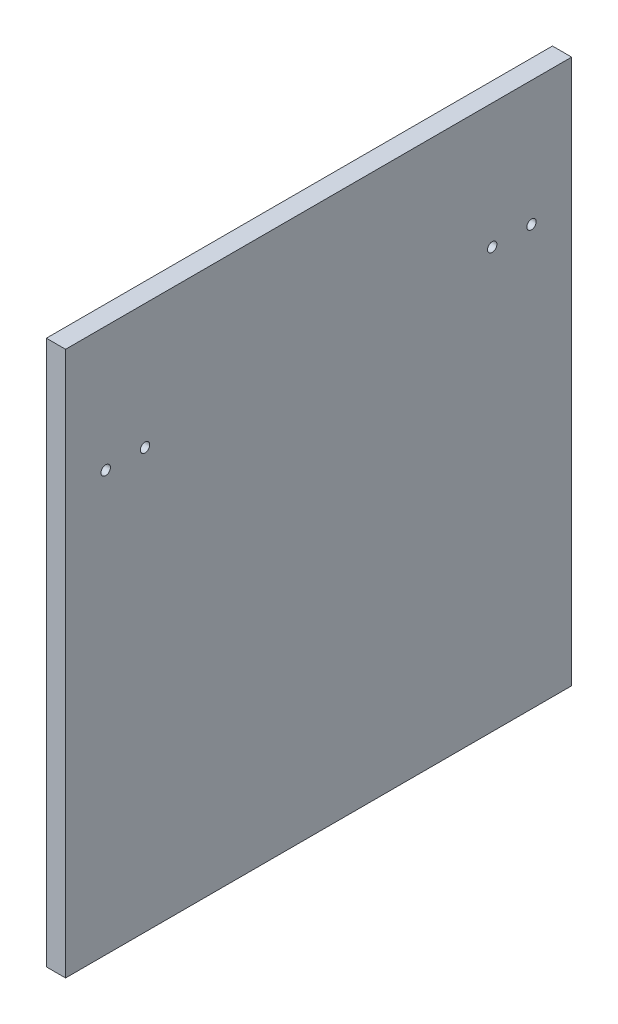
ISO-10303-21;
HEADER;
FILE_DESCRIPTION(('STEP AP214'),'2;1');
FILE_NAME('part.step','',(''),(''),'','','');
FILE_SCHEMA(('AUTOMOTIVE_DESIGN { 1 0 10303 214 1 1 1 1 }'));
ENDSEC;
DATA;
#1=APPLICATION_CONTEXT('core data for automotive mechanical design processes');
#2=APPLICATION_PROTOCOL_DEFINITION('international standard','automotive_design',2000,#1);
#3=PRODUCT_CONTEXT('',#1,'mechanical');
#4=PRODUCT('Part','Part','',(#3));
#5=PRODUCT_RELATED_PRODUCT_CATEGORY('part','',(#4));
#6=PRODUCT_DEFINITION_FORMATION('','',#4);
#7=PRODUCT_DEFINITION_CONTEXT('part definition',#1,'design');
#8=PRODUCT_DEFINITION('design','',#6,#7);
#9=PRODUCT_DEFINITION_SHAPE('','',#8);
#10=(LENGTH_UNIT() NAMED_UNIT(*) SI_UNIT(.MILLI.,.METRE.));
#11=(NAMED_UNIT(*) PLANE_ANGLE_UNIT() SI_UNIT($,.RADIAN.));
#12=(NAMED_UNIT(*) SI_UNIT($,.STERADIAN.) SOLID_ANGLE_UNIT());
#13=UNCERTAINTY_MEASURE_WITH_UNIT(LENGTH_MEASURE(1.E-05),#10,'distance_accuracy_value','');
#14=(GEOMETRIC_REPRESENTATION_CONTEXT(3) GLOBAL_UNCERTAINTY_ASSIGNED_CONTEXT((#13)) GLOBAL_UNIT_ASSIGNED_CONTEXT((#10,
#11,#12)) REPRESENTATION_CONTEXT('',''));
#15=CARTESIAN_POINT('',(0.,0.,0.));
#16=DIRECTION('',(0.,0.,1.));
#17=DIRECTION('',(1.,0.,0.));
#18=AXIS2_PLACEMENT_3D('',#15,#16,#17);
#19=CARTESIAN_POINT('',(6.35,-90.,83.65));
#20=DIRECTION('',(0.,0.,-1.));
#21=DIRECTION('',(-1.,0.,0.));
#22=AXIS2_PLACEMENT_3D('',#19,#20,#21);
#23=PLANE('',#22);
#24=DIRECTION('',(0.,-1.,0.));
#25=VECTOR('',#24,1.);
#26=CARTESIAN_POINT('',(0.,-90.,83.65));
#27=LINE('',#26,#25);
#28=CARTESIAN_POINT('',(0.,90.,83.65));
#29=VERTEX_POINT('',#28);
#30=CARTESIAN_POINT('',(0.,-90.,83.65));
#31=VERTEX_POINT('',#30);
#32=EDGE_CURVE('E96',#29,#31,#27,.T.);
#33=ORIENTED_EDGE('',*,*,#32,.T.);
#34=DIRECTION('',(-1.,0.,0.));
#35=VECTOR('',#34,1.);
#36=CARTESIAN_POINT('',(6.35,-90.,83.65));
#37=LINE('',#36,#35);
#38=CARTESIAN_POINT('',(6.35,-90.,83.65));
#39=VERTEX_POINT('',#38);
#40=EDGE_CURVE('E11',#39,#31,#37,.T.);
#41=ORIENTED_EDGE('',*,*,#40,.F.);
#42=DIRECTION('',(0.,-1.,0.));
#43=VECTOR('',#42,1.);
#44=CARTESIAN_POINT('',(6.35,-90.,83.65));
#45=LINE('',#44,#43);
#46=CARTESIAN_POINT('',(6.35,90.,83.65));
#47=VERTEX_POINT('',#46);
#48=EDGE_CURVE('E84',#47,#39,#45,.T.);
#49=ORIENTED_EDGE('',*,*,#48,.F.);
#50=DIRECTION('',(-1.,0.,0.));
#51=VECTOR('',#50,1.);
#52=CARTESIAN_POINT('',(6.35,90.,83.65));
#53=LINE('',#52,#51);
#54=EDGE_CURVE('E92',#47,#29,#53,.T.);
#55=ORIENTED_EDGE('',*,*,#54,.T.);
#56=EDGE_LOOP('',(#33,#41,#49,#55));
#57=FACE_BOUND('',#56,.T.);
#58=ADVANCED_FACE('F33',(#57),#23,.F.);
#59=CARTESIAN_POINT('',(6.35,-90.,-83.65));
#60=DIRECTION('',(0.,1.,0.));
#61=DIRECTION('',(0.,0.,1.));
#62=AXIS2_PLACEMENT_3D('',#59,#60,#61);
#63=PLANE('',#62);
#64=DIRECTION('',(0.,0.,-1.));
#65=VECTOR('',#64,1.);
#66=CARTESIAN_POINT('',(0.,-90.,-83.65));
#67=LINE('',#66,#65);
#68=CARTESIAN_POINT('',(0.,-90.,-83.65));
#69=VERTEX_POINT('',#68);
#70=EDGE_CURVE('E88',#31,#69,#67,.T.);
#71=ORIENTED_EDGE('',*,*,#70,.T.);
#72=DIRECTION('',(-1.,0.,0.));
#73=VECTOR('',#72,1.);
#74=CARTESIAN_POINT('',(6.35,-90.,-83.65));
#75=LINE('',#74,#73);
#76=CARTESIAN_POINT('',(6.35,-90.,-83.65));
#77=VERTEX_POINT('',#76);
#78=EDGE_CURVE('E41',#77,#69,#75,.T.);
#79=ORIENTED_EDGE('',*,*,#78,.F.);
#80=DIRECTION('',(0.,0.,-1.));
#81=VECTOR('',#80,1.);
#82=CARTESIAN_POINT('',(6.35,-90.,-83.65));
#83=LINE('',#82,#81);
#84=EDGE_CURVE('E79',#39,#77,#83,.T.);
#85=ORIENTED_EDGE('',*,*,#84,.F.);
#86=ORIENTED_EDGE('',*,*,#40,.T.);
#87=EDGE_LOOP('',(#71,#79,#85,#86));
#88=FACE_BOUND('',#87,.T.);
#89=ADVANCED_FACE('F87',(#88),#63,.F.);
#90=CARTESIAN_POINT('',(6.35,-90.,-83.65));
#91=DIRECTION('',(0.,0.,1.));
#92=DIRECTION('',(1.,0.,0.));
#93=AXIS2_PLACEMENT_3D('',#90,#91,#92);
#94=PLANE('',#93);
#95=DIRECTION('',(0.,1.,0.));
#96=VECTOR('',#95,1.);
#97=CARTESIAN_POINT('',(0.,-90.,-83.65));
#98=LINE('',#97,#96);
#99=CARTESIAN_POINT('',(0.,90.,-83.65));
#100=VERTEX_POINT('',#99);
#101=EDGE_CURVE('E66',#69,#100,#98,.T.);
#102=ORIENTED_EDGE('',*,*,#101,.T.);
#103=DIRECTION('',(-1.,0.,0.));
#104=VECTOR('',#103,1.);
#105=CARTESIAN_POINT('',(6.35,90.,-83.65));
#106=LINE('',#105,#104);
#107=CARTESIAN_POINT('',(6.35,90.,-83.65));
#108=VERTEX_POINT('',#107);
#109=EDGE_CURVE('E89',#108,#100,#106,.T.);
#110=ORIENTED_EDGE('',*,*,#109,.F.);
#111=DIRECTION('',(0.,1.,0.));
#112=VECTOR('',#111,1.);
#113=CARTESIAN_POINT('',(6.35,-90.,-83.65));
#114=LINE('',#113,#112);
#115=EDGE_CURVE('E82',#77,#108,#114,.T.);
#116=ORIENTED_EDGE('',*,*,#115,.F.);
#117=ORIENTED_EDGE('',*,*,#78,.T.);
#118=EDGE_LOOP('',(#102,#110,#116,#117));
#119=FACE_BOUND('',#118,.T.);
#120=ADVANCED_FACE('F90',(#119),#94,.F.);
#121=CARTESIAN_POINT('',(6.35,90.,-83.65));
#122=DIRECTION('',(0.,-1.,0.));
#123=DIRECTION('',(0.,0.,-1.));
#124=AXIS2_PLACEMENT_3D('',#121,#122,#123);
#125=PLANE('',#124);
#126=DIRECTION('',(0.,0.,1.));
#127=VECTOR('',#126,1.);
#128=CARTESIAN_POINT('',(0.,90.,-83.65));
#129=LINE('',#128,#127);
#130=EDGE_CURVE('E72',#100,#29,#129,.T.);
#131=ORIENTED_EDGE('',*,*,#130,.T.);
#132=ORIENTED_EDGE('',*,*,#54,.F.);
#133=DIRECTION('',(0.,0.,1.));
#134=VECTOR('',#133,1.);
#135=CARTESIAN_POINT('',(6.35,90.,-83.65));
#136=LINE('',#135,#134);
#137=EDGE_CURVE('E49',#108,#47,#136,.T.);
#138=ORIENTED_EDGE('',*,*,#137,.F.);
#139=ORIENTED_EDGE('',*,*,#109,.T.);
#140=EDGE_LOOP('',(#131,#132,#138,#139));
#141=FACE_BOUND('',#140,.T.);
#142=ADVANCED_FACE('F104',(#141),#125,.F.);
#143=CARTESIAN_POINT('',(6.35,0.,0.));
#144=DIRECTION('',(1.,0.,0.));
#145=DIRECTION('',(0.,0.,-1.));
#146=AXIS2_PLACEMENT_3D('',#143,#144,#145);
#147=PLANE('',#146);
#148=CARTESIAN_POINT('',(6.35,48.7496722680963,-70.3779535819625));
#149=DIRECTION('',(-1.,0.,0.));
#150=DIRECTION('',(0.,0.,1.));
#151=AXIS2_PLACEMENT_3D('',#148,#149,#150);
#152=CIRCLE('',#151,1.54999999999999);
#153=CARTESIAN_POINT('',(6.35,48.7496722680963,-68.8279535819625));
#154=VERTEX_POINT('',#153);
#155=EDGE_CURVE('E125',#154,#154,#152,.T.);
#156=ORIENTED_EDGE('',*,*,#155,.T.);
#157=EDGE_LOOP('',(#156));
#158=FACE_BOUND('',#157,.T.);
#159=CARTESIAN_POINT('',(6.35,48.7496722680962,-57.3878809882991));
#160=DIRECTION('',(-1.,0.,0.));
#161=DIRECTION('',(0.,0.,1.));
#162=AXIS2_PLACEMENT_3D('',#159,#160,#161);
#163=CIRCLE('',#162,1.55000000000001);
#164=CARTESIAN_POINT('',(6.35,48.7496722680962,-55.8378809882991));
#165=VERTEX_POINT('',#164);
#166=EDGE_CURVE('E119',#165,#165,#163,.T.);
#167=ORIENTED_EDGE('',*,*,#166,.T.);
#168=EDGE_LOOP('',(#167));
#169=FACE_BOUND('',#168,.T.);
#170=CARTESIAN_POINT('',(6.35,48.7496722680953,70.3779535819625));
#171=DIRECTION('',(-1.,0.,0.));
#172=DIRECTION('',(0.,0.,1.));
#173=AXIS2_PLACEMENT_3D('',#170,#171,#172);
#174=CIRCLE('',#173,1.54999999999894);
#175=CARTESIAN_POINT('',(6.35,48.7496722680953,71.9279535819615));
#176=VERTEX_POINT('',#175);
#177=EDGE_CURVE('E113',#176,#176,#174,.T.);
#178=ORIENTED_EDGE('',*,*,#177,.T.);
#179=EDGE_LOOP('',(#178));
#180=FACE_BOUND('',#179,.T.);
#181=CARTESIAN_POINT('',(6.35,48.7496722680954,57.3873135461074));
#182=DIRECTION('',(-1.,0.,0.));
#183=DIRECTION('',(0.,0.,1.));
#184=AXIS2_PLACEMENT_3D('',#181,#182,#183);
#185=CIRCLE('',#184,1.55000000000001);
#186=CARTESIAN_POINT('',(6.35,48.7496722680954,58.9373135461074));
#187=VERTEX_POINT('',#186);
#188=EDGE_CURVE('E99',#187,#187,#185,.T.);
#189=ORIENTED_EDGE('',*,*,#188,.T.);
#190=EDGE_LOOP('',(#189));
#191=FACE_BOUND('',#190,.T.);
#192=ORIENTED_EDGE('',*,*,#48,.T.);
#193=ORIENTED_EDGE('',*,*,#84,.T.);
#194=ORIENTED_EDGE('',*,*,#115,.T.);
#195=ORIENTED_EDGE('',*,*,#137,.T.);
#196=EDGE_LOOP('',(#192,#193,#194,#195));
#197=FACE_BOUND('',#196,.T.);
#198=ADVANCED_FACE('F80',(#158,#169,#180,#191,#197),#147,.T.);
#199=CARTESIAN_POINT('',(0.,0.,0.));
#200=DIRECTION('',(1.,0.,0.));
#201=DIRECTION('',(0.,0.,-1.));
#202=AXIS2_PLACEMENT_3D('',#199,#200,#201);
#203=PLANE('',#202);
#204=CARTESIAN_POINT('',(0.,48.7496722680963,-70.3779535819625));
#205=DIRECTION('',(-1.,0.,0.));
#206=DIRECTION('',(0.,0.,1.));
#207=AXIS2_PLACEMENT_3D('',#204,#205,#206);
#208=CIRCLE('',#207,1.54999999999999);
#209=CARTESIAN_POINT('',(0.,48.7496722680963,-68.8279535819625));
#210=VERTEX_POINT('',#209);
#211=EDGE_CURVE('E128',#210,#210,#208,.T.);
#212=ORIENTED_EDGE('',*,*,#211,.F.);
#213=EDGE_LOOP('',(#212));
#214=FACE_BOUND('',#213,.T.);
#215=CARTESIAN_POINT('',(0.,48.7496722680962,-57.3878809882991));
#216=DIRECTION('',(-1.,0.,0.));
#217=DIRECTION('',(0.,0.,1.));
#218=AXIS2_PLACEMENT_3D('',#215,#216,#217);
#219=CIRCLE('',#218,1.55000000000001);
#220=CARTESIAN_POINT('',(0.,48.7496722680962,-55.8378809882991));
#221=VERTEX_POINT('',#220);
#222=EDGE_CURVE('E122',#221,#221,#219,.T.);
#223=ORIENTED_EDGE('',*,*,#222,.F.);
#224=EDGE_LOOP('',(#223));
#225=FACE_BOUND('',#224,.T.);
#226=CARTESIAN_POINT('',(0.,48.7496722680953,70.3779535819625));
#227=DIRECTION('',(-1.,0.,0.));
#228=DIRECTION('',(0.,0.,1.));
#229=AXIS2_PLACEMENT_3D('',#226,#227,#228);
#230=CIRCLE('',#229,1.54999999999894);
#231=CARTESIAN_POINT('',(0.,48.7496722680953,71.9279535819615));
#232=VERTEX_POINT('',#231);
#233=EDGE_CURVE('E116',#232,#232,#230,.T.);
#234=ORIENTED_EDGE('',*,*,#233,.F.);
#235=EDGE_LOOP('',(#234));
#236=FACE_BOUND('',#235,.T.);
#237=CARTESIAN_POINT('',(0.,48.7496722680954,57.3873135461074));
#238=DIRECTION('',(-1.,0.,0.));
#239=DIRECTION('',(0.,0.,1.));
#240=AXIS2_PLACEMENT_3D('',#237,#238,#239);
#241=CIRCLE('',#240,1.55000000000001);
#242=CARTESIAN_POINT('',(0.,48.7496722680954,58.9373135461074));
#243=VERTEX_POINT('',#242);
#244=EDGE_CURVE('E110',#243,#243,#241,.T.);
#245=ORIENTED_EDGE('',*,*,#244,.F.);
#246=EDGE_LOOP('',(#245));
#247=FACE_BOUND('',#246,.T.);
#248=ORIENTED_EDGE('',*,*,#32,.F.);
#249=ORIENTED_EDGE('',*,*,#130,.F.);
#250=ORIENTED_EDGE('',*,*,#101,.F.);
#251=ORIENTED_EDGE('',*,*,#70,.F.);
#252=EDGE_LOOP('',(#248,#249,#250,#251));
#253=FACE_BOUND('',#252,.T.);
#254=ADVANCED_FACE('F107',(#214,#225,#236,#247,#253),#203,.F.);
#255=CARTESIAN_POINT('',(6.35,48.7496722680954,57.3873135461074));
#256=DIRECTION('',(-1.,0.,0.));
#257=DIRECTION('',(0.,0.,1.));
#258=AXIS2_PLACEMENT_3D('',#255,#256,#257);
#259=CYLINDRICAL_SURFACE('',#258,1.55000000000001);
#260=ORIENTED_EDGE('',*,*,#188,.F.);
#261=EDGE_LOOP('',(#260));
#262=FACE_BOUND('',#261,.T.);
#263=ORIENTED_EDGE('',*,*,#244,.T.);
#264=EDGE_LOOP('',(#263));
#265=FACE_BOUND('',#264,.T.);
#266=ADVANCED_FACE('F145',(#262,#265),#259,.F.);
#267=CARTESIAN_POINT('',(6.35,48.7496722680953,70.3779535819625));
#268=DIRECTION('',(-1.,0.,0.));
#269=DIRECTION('',(0.,0.,1.));
#270=AXIS2_PLACEMENT_3D('',#267,#268,#269);
#271=CYLINDRICAL_SURFACE('',#270,1.54999999999894);
#272=ORIENTED_EDGE('',*,*,#177,.F.);
#273=EDGE_LOOP('',(#272));
#274=FACE_BOUND('',#273,.T.);
#275=ORIENTED_EDGE('',*,*,#233,.T.);
#276=EDGE_LOOP('',(#275));
#277=FACE_BOUND('',#276,.T.);
#278=ADVANCED_FACE('F154',(#274,#277),#271,.F.);
#279=CARTESIAN_POINT('',(6.35,48.7496722680962,-57.3878809882991));
#280=DIRECTION('',(-1.,0.,0.));
#281=DIRECTION('',(0.,0.,1.));
#282=AXIS2_PLACEMENT_3D('',#279,#280,#281);
#283=CYLINDRICAL_SURFACE('',#282,1.55000000000001);
#284=ORIENTED_EDGE('',*,*,#166,.F.);
#285=EDGE_LOOP('',(#284));
#286=FACE_BOUND('',#285,.T.);
#287=ORIENTED_EDGE('',*,*,#222,.T.);
#288=EDGE_LOOP('',(#287));
#289=FACE_BOUND('',#288,.T.);
#290=ADVANCED_FACE('F139',(#286,#289),#283,.F.);
#291=CARTESIAN_POINT('',(6.35,48.7496722680963,-70.3779535819625));
#292=DIRECTION('',(-1.,0.,0.));
#293=DIRECTION('',(0.,0.,1.));
#294=AXIS2_PLACEMENT_3D('',#291,#292,#293);
#295=CYLINDRICAL_SURFACE('',#294,1.54999999999999);
#296=ORIENTED_EDGE('',*,*,#155,.F.);
#297=EDGE_LOOP('',(#296));
#298=FACE_BOUND('',#297,.T.);
#299=ORIENTED_EDGE('',*,*,#211,.T.);
#300=EDGE_LOOP('',(#299));
#301=FACE_BOUND('',#300,.T.);
#302=ADVANCED_FACE('F136',(#298,#301),#295,.F.);
#303=CLOSED_SHELL('',(#58,#89,#120,#142,#198,#254,#266,#278,#290,#302));
#304=MANIFOLD_SOLID_BREP('B2',#303);
#305=ADVANCED_BREP_SHAPE_REPRESENTATION('',(#18,#304),#14);
#306=SHAPE_DEFINITION_REPRESENTATION(#9,#305);
ENDSEC;
END-ISO-10303-21;
